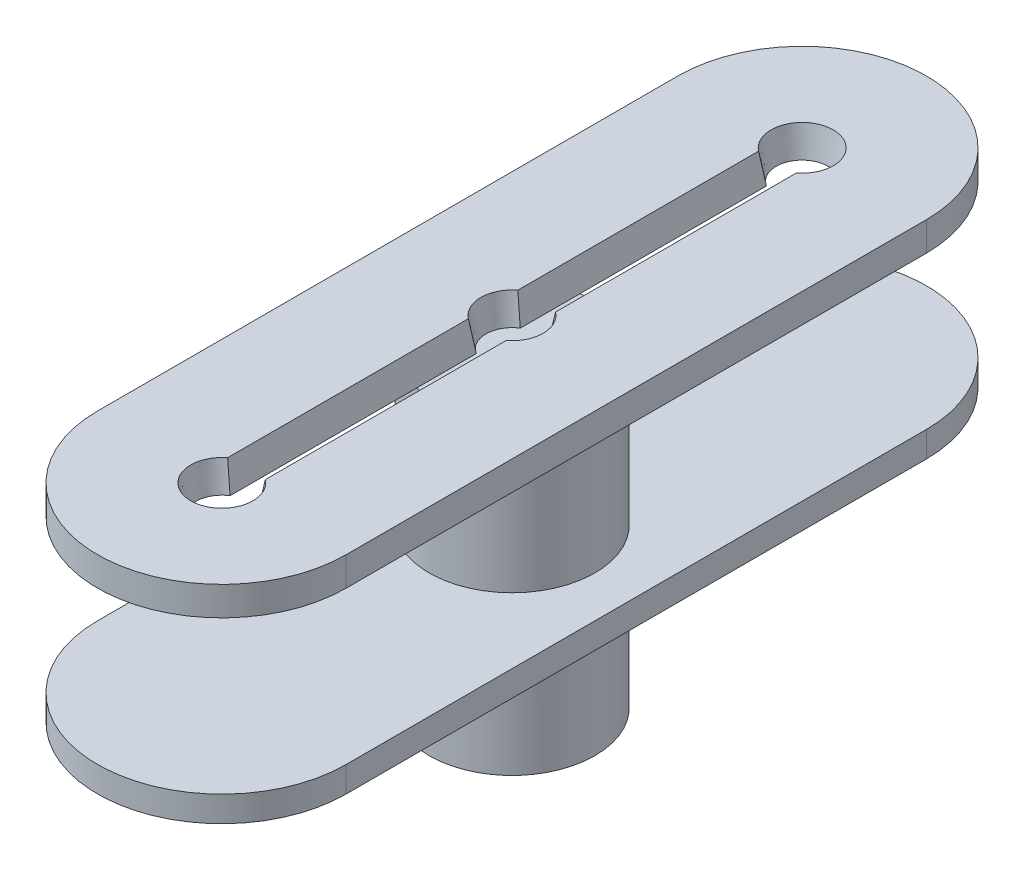
ISO-10303-21;
HEADER;
FILE_DESCRIPTION(('STEP AP214'),'2;1');
FILE_NAME('part.step','',(''),(''),'','','');
FILE_SCHEMA(('AUTOMOTIVE_DESIGN { 1 0 10303 214 1 1 1 1 }'));
ENDSEC;
DATA;
#1=APPLICATION_CONTEXT('core data for automotive mechanical design processes');
#2=APPLICATION_PROTOCOL_DEFINITION('international standard','automotive_design',2000,#1);
#3=PRODUCT_CONTEXT('',#1,'mechanical');
#4=PRODUCT('Part','Part','',(#3));
#5=PRODUCT_RELATED_PRODUCT_CATEGORY('part','',(#4));
#6=PRODUCT_DEFINITION_FORMATION('','',#4);
#7=PRODUCT_DEFINITION_CONTEXT('part definition',#1,'design');
#8=PRODUCT_DEFINITION('design','',#6,#7);
#9=PRODUCT_DEFINITION_SHAPE('','',#8);
#10=(LENGTH_UNIT() NAMED_UNIT(*) SI_UNIT(.MILLI.,.METRE.));
#11=(NAMED_UNIT(*) PLANE_ANGLE_UNIT() SI_UNIT($,.RADIAN.));
#12=(NAMED_UNIT(*) SI_UNIT($,.STERADIAN.) SOLID_ANGLE_UNIT());
#13=UNCERTAINTY_MEASURE_WITH_UNIT(LENGTH_MEASURE(1.E-05),#10,'distance_accuracy_value','');
#14=(GEOMETRIC_REPRESENTATION_CONTEXT(3) GLOBAL_UNCERTAINTY_ASSIGNED_CONTEXT((#13)) GLOBAL_UNIT_ASSIGNED_CONTEXT((#10,
#11,#12)) REPRESENTATION_CONTEXT('',''));
#15=CARTESIAN_POINT('',(0.,0.,0.));
#16=DIRECTION('',(0.,0.,1.));
#17=DIRECTION('',(1.,0.,0.));
#18=AXIS2_PLACEMENT_3D('',#15,#16,#17);
#19=CARTESIAN_POINT('',(0.,-3.2,0.));
#20=DIRECTION('',(0.,1.,0.));
#21=DIRECTION('',(0.,0.,1.));
#22=AXIS2_PLACEMENT_3D('',#19,#20,#21);
#23=CYLINDRICAL_SURFACE('',#22,2.);
#24=CARTESIAN_POINT('',(0.,4.3,0.));
#25=DIRECTION('',(0.,-1.,0.));
#26=DIRECTION('',(0.,0.,-1.));
#27=AXIS2_PLACEMENT_3D('',#24,#25,#26);
#28=CIRCLE('',#27,2.);
#29=CARTESIAN_POINT('',(0.332158694182165,4.3,-1.9722247848253));
#30=VERTEX_POINT('',#29);
#31=CARTESIAN_POINT('',(0.332158694182165,4.3,1.9722247848253));
#32=VERTEX_POINT('',#31);
#33=EDGE_CURVE('E60',#30,#32,#28,.T.);
#34=ORIENTED_EDGE('',*,*,#33,.T.);
#35=CARTESIAN_POINT('',(-0.332158694182165,4.3,1.9722247848253));
#36=VERTEX_POINT('',#35);
#37=EDGE_CURVE('E216',#32,#36,#28,.T.);
#38=ORIENTED_EDGE('',*,*,#37,.T.);
#39=CARTESIAN_POINT('',(-0.332158694182165,4.3,-1.9722247848253));
#40=VERTEX_POINT('',#39);
#41=EDGE_CURVE('E67',#36,#40,#28,.T.);
#42=ORIENTED_EDGE('',*,*,#41,.T.);
#43=EDGE_CURVE('E217',#40,#30,#28,.T.);
#44=ORIENTED_EDGE('',*,*,#43,.T.);
#45=EDGE_LOOP('',(#34,#38,#42,#44));
#46=FACE_BOUND('',#45,.T.);
#47=CARTESIAN_POINT('',(0.,0.617728594575585,0.));
#48=DIRECTION('',(0.,-1.,0.));
#49=DIRECTION('',(0.,0.,-1.));
#50=AXIS2_PLACEMENT_3D('',#47,#48,#49);
#51=CIRCLE('',#50,2.);
#52=CARTESIAN_POINT('',(0.,0.617728594575585,-2.));
#53=VERTEX_POINT('',#52);
#54=EDGE_CURVE('E53',#53,#53,#51,.T.);
#55=ORIENTED_EDGE('',*,*,#54,.F.);
#56=EDGE_LOOP('',(#55));
#57=FACE_BOUND('',#56,.T.);
#58=ADVANCED_FACE('F44',(#46,#57),#23,.T.);
#59=CARTESIAN_POINT('',(-3.,5.,7.));
#60=DIRECTION('',(1.,0.,0.));
#61=DIRECTION('',(0.,0.,-1.));
#62=AXIS2_PLACEMENT_3D('',#59,#60,#61);
#63=PLANE('',#62);
#64=DIRECTION('',(0.,-1.,0.));
#65=VECTOR('',#64,1.);
#66=CARTESIAN_POINT('',(-3.,5.,-7.));
#67=LINE('',#66,#65);
#68=CARTESIAN_POINT('',(-3.,5.,-7.));
#69=VERTEX_POINT('',#68);
#70=CARTESIAN_POINT('',(-3.,4.3,-7.));
#71=VERTEX_POINT('',#70);
#72=EDGE_CURVE('E430',#69,#71,#67,.T.);
#73=ORIENTED_EDGE('',*,*,#72,.T.);
#74=DIRECTION('',(0.,0.,1.));
#75=VECTOR('',#74,1.);
#76=CARTESIAN_POINT('',(-3.,4.3,10.));
#77=LINE('',#76,#75);
#78=CARTESIAN_POINT('',(-3.,4.3,7.));
#79=VERTEX_POINT('',#78);
#80=EDGE_CURVE('E218',#71,#79,#77,.T.);
#81=ORIENTED_EDGE('',*,*,#80,.T.);
#82=DIRECTION('',(0.,-1.,0.));
#83=VECTOR('',#82,1.);
#84=CARTESIAN_POINT('',(-3.,5.,7.));
#85=LINE('',#84,#83);
#86=CARTESIAN_POINT('',(-3.,5.,7.));
#87=VERTEX_POINT('',#86);
#88=EDGE_CURVE('E434',#87,#79,#85,.T.);
#89=ORIENTED_EDGE('',*,*,#88,.F.);
#90=DIRECTION('',(0.,0.,1.));
#91=VECTOR('',#90,1.);
#92=CARTESIAN_POINT('',(-3.,5.,7.));
#93=LINE('',#92,#91);
#94=EDGE_CURVE('E438',#69,#87,#93,.T.);
#95=ORIENTED_EDGE('',*,*,#94,.F.);
#96=EDGE_LOOP('',(#73,#81,#89,#95));
#97=FACE_BOUND('',#96,.T.);
#98=ADVANCED_FACE('F348',(#97),#63,.F.);
#99=CARTESIAN_POINT('',(0.,5.,-7.));
#100=DIRECTION('',(0.,-1.,0.));
#101=DIRECTION('',(0.,0.,-1.));
#102=AXIS2_PLACEMENT_3D('',#99,#100,#101);
#103=CYLINDRICAL_SURFACE('',#102,3.);
#104=DIRECTION('',(0.,-1.,0.));
#105=VECTOR('',#104,1.);
#106=CARTESIAN_POINT('',(3.,5.,-7.));
#107=LINE('',#106,#105);
#108=CARTESIAN_POINT('',(3.,5.,-7.));
#109=VERTEX_POINT('',#108);
#110=CARTESIAN_POINT('',(3.,4.3,-7.));
#111=VERTEX_POINT('',#110);
#112=EDGE_CURVE('E426',#109,#111,#107,.T.);
#113=ORIENTED_EDGE('',*,*,#112,.T.);
#114=CARTESIAN_POINT('',(0.,4.3,-7.));
#115=DIRECTION('',(0.,1.,0.));
#116=DIRECTION('',(0.,0.,1.));
#117=AXIS2_PLACEMENT_3D('',#114,#115,#116);
#118=CIRCLE('',#117,3.);
#119=EDGE_CURVE('E251',#111,#71,#118,.T.);
#120=ORIENTED_EDGE('',*,*,#119,.T.);
#121=ORIENTED_EDGE('',*,*,#72,.F.);
#122=CARTESIAN_POINT('',(0.,5.,-7.));
#123=DIRECTION('',(0.,1.,0.));
#124=DIRECTION('',(0.,0.,1.));
#125=AXIS2_PLACEMENT_3D('',#122,#123,#124);
#126=CIRCLE('',#125,3.);
#127=EDGE_CURVE('E441',#109,#69,#126,.T.);
#128=ORIENTED_EDGE('',*,*,#127,.F.);
#129=EDGE_LOOP('',(#113,#120,#121,#128));
#130=FACE_BOUND('',#129,.T.);
#131=ADVANCED_FACE('F351',(#130),#103,.T.);
#132=CARTESIAN_POINT('',(3.,5.,7.));
#133=DIRECTION('',(-1.,0.,0.));
#134=DIRECTION('',(0.,0.,1.));
#135=AXIS2_PLACEMENT_3D('',#132,#133,#134);
#136=PLANE('',#135);
#137=DIRECTION('',(0.,-1.,0.));
#138=VECTOR('',#137,1.);
#139=CARTESIAN_POINT('',(3.,5.,7.));
#140=LINE('',#139,#138);
#141=CARTESIAN_POINT('',(3.,5.,7.));
#142=VERTEX_POINT('',#141);
#143=CARTESIAN_POINT('',(3.,4.3,7.));
#144=VERTEX_POINT('',#143);
#145=EDGE_CURVE('E422',#142,#144,#140,.T.);
#146=ORIENTED_EDGE('',*,*,#145,.T.);
#147=DIRECTION('',(0.,0.,1.));
#148=VECTOR('',#147,1.);
#149=CARTESIAN_POINT('',(3.,4.3,10.));
#150=LINE('',#149,#148);
#151=EDGE_CURVE('E213',#111,#144,#150,.T.);
#152=ORIENTED_EDGE('',*,*,#151,.F.);
#153=ORIENTED_EDGE('',*,*,#112,.F.);
#154=DIRECTION('',(0.,0.,-1.));
#155=VECTOR('',#154,1.);
#156=CARTESIAN_POINT('',(3.,5.,7.));
#157=LINE('',#156,#155);
#158=EDGE_CURVE('E443',#142,#109,#157,.T.);
#159=ORIENTED_EDGE('',*,*,#158,.F.);
#160=EDGE_LOOP('',(#146,#152,#153,#159));
#161=FACE_BOUND('',#160,.T.);
#162=ADVANCED_FACE('F354',(#161),#136,.F.);
#163=CARTESIAN_POINT('',(0.,5.,7.));
#164=DIRECTION('',(0.,-1.,0.));
#165=DIRECTION('',(0.,0.,-1.));
#166=AXIS2_PLACEMENT_3D('',#163,#164,#165);
#167=CYLINDRICAL_SURFACE('',#166,3.);
#168=CARTESIAN_POINT('',(0.,4.3,7.));
#169=DIRECTION('',(0.,1.,0.));
#170=DIRECTION('',(0.,0.,1.));
#171=AXIS2_PLACEMENT_3D('',#168,#169,#170);
#172=CIRCLE('',#171,3.);
#173=EDGE_CURVE('E254',#79,#144,#172,.T.);
#174=ORIENTED_EDGE('',*,*,#173,.T.);
#175=ORIENTED_EDGE('',*,*,#145,.F.);
#176=CARTESIAN_POINT('',(0.,5.,7.));
#177=DIRECTION('',(0.,1.,0.));
#178=DIRECTION('',(0.,0.,1.));
#179=AXIS2_PLACEMENT_3D('',#176,#177,#178);
#180=CIRCLE('',#179,3.);
#181=EDGE_CURVE('E299',#87,#142,#180,.T.);
#182=ORIENTED_EDGE('',*,*,#181,.F.);
#183=ORIENTED_EDGE('',*,*,#88,.T.);
#184=EDGE_LOOP('',(#174,#175,#182,#183));
#185=FACE_BOUND('',#184,.T.);
#186=ADVANCED_FACE('F46',(#185),#167,.T.);
#187=CARTESIAN_POINT('',(0.,5.,7.));
#188=DIRECTION('',(0.,1.,0.));
#189=DIRECTION('',(0.,0.,1.));
#190=AXIS2_PLACEMENT_3D('',#187,#188,#189);
#191=PLANE('',#190);
#192=CARTESIAN_POINT('',(0.,5.,-7.));
#193=DIRECTION('',(0.,1.,0.));
#194=DIRECTION('',(0.,0.,1.));
#195=AXIS2_PLACEMENT_3D('',#192,#193,#194);
#196=CIRCLE('',#195,0.75);
#197=CARTESIAN_POINT('',(0.45558758067809,5.,-6.4042316252671));
#198=VERTEX_POINT('',#197);
#199=CARTESIAN_POINT('',(-0.455587580678091,5.,-6.4042316252671));
#200=VERTEX_POINT('',#199);
#201=EDGE_CURVE('E257',#198,#200,#196,.T.);
#202=ORIENTED_EDGE('',*,*,#201,.F.);
#203=DIRECTION('',(0.,0.,-1.));
#204=VECTOR('',#203,1.);
#205=CARTESIAN_POINT('',(0.45558758067809,5.,-6.4042316252671));
#206=LINE('',#205,#204);
#207=CARTESIAN_POINT('',(0.455587580678091,5.,-0.595768374732903));
#208=VERTEX_POINT('',#207);
#209=EDGE_CURVE('E285',#208,#198,#206,.T.);
#210=ORIENTED_EDGE('',*,*,#209,.F.);
#211=CARTESIAN_POINT('',(0.,5.,0.));
#212=DIRECTION('',(0.,1.,0.));
#213=DIRECTION('',(0.,0.,1.));
#214=AXIS2_PLACEMENT_3D('',#211,#212,#213);
#215=CIRCLE('',#214,0.75);
#216=CARTESIAN_POINT('',(0.45558758067809,5.,0.595768374732903));
#217=VERTEX_POINT('',#216);
#218=EDGE_CURVE('E281',#217,#208,#215,.T.);
#219=ORIENTED_EDGE('',*,*,#218,.F.);
#220=DIRECTION('',(0.,0.,-1.));
#221=VECTOR('',#220,1.);
#222=CARTESIAN_POINT('',(0.45558758067809,5.,0.595768374732903));
#223=LINE('',#222,#221);
#224=CARTESIAN_POINT('',(0.455587580678091,5.,6.4042316252671));
#225=VERTEX_POINT('',#224);
#226=EDGE_CURVE('E277',#225,#217,#223,.T.);
#227=ORIENTED_EDGE('',*,*,#226,.F.);
#228=CARTESIAN_POINT('',(0.,5.,7.));
#229=DIRECTION('',(0.,1.,0.));
#230=DIRECTION('',(0.,0.,1.));
#231=AXIS2_PLACEMENT_3D('',#228,#229,#230);
#232=CIRCLE('',#231,0.75);
#233=CARTESIAN_POINT('',(-0.455587580678089,5.,6.4042316252671));
#234=VERTEX_POINT('',#233);
#235=EDGE_CURVE('E273',#234,#225,#232,.T.);
#236=ORIENTED_EDGE('',*,*,#235,.F.);
#237=DIRECTION('',(0.,0.,1.));
#238=VECTOR('',#237,1.);
#239=CARTESIAN_POINT('',(-0.455587580678091,5.,0.595768374732903));
#240=LINE('',#239,#238);
#241=CARTESIAN_POINT('',(-0.455587580678091,5.,0.595768374732903));
#242=VERTEX_POINT('',#241);
#243=EDGE_CURVE('E269',#242,#234,#240,.T.);
#244=ORIENTED_EDGE('',*,*,#243,.F.);
#245=CARTESIAN_POINT('',(0.,5.,0.));
#246=DIRECTION('',(0.,1.,0.));
#247=DIRECTION('',(0.,0.,1.));
#248=AXIS2_PLACEMENT_3D('',#245,#246,#247);
#249=CIRCLE('',#248,0.75);
#250=CARTESIAN_POINT('',(-0.455587580678091,5.,-0.595768374732902));
#251=VERTEX_POINT('',#250);
#252=EDGE_CURVE('E265',#251,#242,#249,.T.);
#253=ORIENTED_EDGE('',*,*,#252,.F.);
#254=DIRECTION('',(0.,0.,1.));
#255=VECTOR('',#254,1.);
#256=CARTESIAN_POINT('',(-0.455587580678091,5.,-6.4042316252671));
#257=LINE('',#256,#255);
#258=EDGE_CURVE('E261',#200,#251,#257,.T.);
#259=ORIENTED_EDGE('',*,*,#258,.F.);
#260=EDGE_LOOP('',(#202,#210,#219,#227,#236,#244,#253,#259));
#261=FACE_BOUND('',#260,.T.);
#262=ORIENTED_EDGE('',*,*,#181,.T.);
#263=ORIENTED_EDGE('',*,*,#158,.T.);
#264=ORIENTED_EDGE('',*,*,#127,.T.);
#265=ORIENTED_EDGE('',*,*,#94,.T.);
#266=EDGE_LOOP('',(#262,#263,#264,#265));
#267=FACE_BOUND('',#266,.T.);
#268=ADVANCED_FACE('F343',(#261,#267),#191,.T.);
#269=CARTESIAN_POINT('',(-0.455587580678091,5.,-6.4042316252671));
#270=DIRECTION('',(-0.984807753012208,-0.173648177666931,0.));
#271=DIRECTION('',(0.173648177666931,-0.984807753012208,0.));
#272=AXIS2_PLACEMENT_3D('',#269,#270,#271);
#273=PLANE('',#272);
#274=CARTESIAN_POINT('',(-0.279260599969625,4.,-0.501113011572985));
#275=CARTESIAN_POINT('',(-0.293942387979891,4.0832645574221,-0.509736635471561));
#276=CARTESIAN_POINT('',(-0.30862795832783,4.16655056554708,-0.518144217812719));
#277=CARTESIAN_POINT('',(-0.338005317972142,4.33315785120624,-0.534577093714794));
#278=CARTESIAN_POINT('',(-0.352697107165911,4.41647912815852,-0.542602393352512));
#279=CARTESIAN_POINT('',(-0.382085948727496,4.58315153100636,-0.558320728057934));
#280=CARTESIAN_POINT('',(-0.396783001067315,4.66650265674314,-0.566013764867417));
#281=CARTESIAN_POINT('',(-0.426181924106393,4.83323223449101,-0.581103959904622));
#282=CARTESIAN_POINT('',(-0.440883794878428,4.91661068691482,-0.588501113434233));
#283=CARTESIAN_POINT('',(-0.455587580678091,5.,-0.595768374732903));
#284=B_SPLINE_CURVE_WITH_KNOTS('',3,(#274,#275,#276,#277,#278,#279,#280,#281,#282,#283),
.UNSPECIFIED.,.F.,.F.,(4,2,2,2,4),(0.,0.254962444373639,0.509920834487025,0.7648778879025,
1.01983898798709),.UNSPECIFIED.);
#285=CARTESIAN_POINT('',(-0.332158694182165,4.3,-0.531283316279492));
#286=VERTEX_POINT('',#285);
#287=EDGE_CURVE('E476',#286,#251,#284,.T.);
#288=ORIENTED_EDGE('',*,*,#287,.F.);
#289=DIRECTION('',(0.,0.,-1.));
#290=VECTOR('',#289,1.);
#291=CARTESIAN_POINT('',(-0.332158694182166,4.3,-6.4042316252671));
#292=LINE('',#291,#290);
#293=EDGE_CURVE('E412',#286,#40,#292,.T.);
#294=ORIENTED_EDGE('',*,*,#293,.T.);
#295=CARTESIAN_POINT('',(-0.332158694182168,4.30000000000001,-6.46871668372049));
#296=VERTEX_POINT('',#295);
#297=EDGE_CURVE('E416',#40,#296,#292,.T.);
#298=ORIENTED_EDGE('',*,*,#297,.T.);
#299=CARTESIAN_POINT('',(-0.279260599969626,4.,-6.49888698842701));
#300=CARTESIAN_POINT('',(-0.293942387979891,4.0832645574221,-6.49026336452844));
#301=CARTESIAN_POINT('',(-0.308627958327831,4.16655056554708,-6.48185578218728));
#302=CARTESIAN_POINT('',(-0.338005317972143,4.33315785120624,-6.46542290628521));
#303=CARTESIAN_POINT('',(-0.352697107165912,4.41647912815852,-6.45739760664749));
#304=CARTESIAN_POINT('',(-0.382085948727497,4.58315153100636,-6.44167927194207));
#305=CARTESIAN_POINT('',(-0.396783001067315,4.66650265674314,-6.43398623513258));
#306=CARTESIAN_POINT('',(-0.426181924106394,4.83323223449101,-6.41889604009538));
#307=CARTESIAN_POINT('',(-0.440883794878428,4.91661068691482,-6.41149888656577));
#308=CARTESIAN_POINT('',(-0.455587580678091,5.,-6.4042316252671));
#309=B_SPLINE_CURVE_WITH_KNOTS('',3,(#299,#300,#301,#302,#303,#304,#305,#306,#307,#308),
.UNSPECIFIED.,.F.,.F.,(4,2,2,2,4),(0.,0.254962444373639,0.509920834487025,0.7648778879025,
1.01983898798709),.UNSPECIFIED.);
#310=EDGE_CURVE('E289',#296,#200,#309,.T.);
#311=ORIENTED_EDGE('',*,*,#310,.T.);
#312=ORIENTED_EDGE('',*,*,#258,.T.);
#313=EDGE_LOOP('',(#288,#294,#298,#311,#312));
#314=FACE_BOUND('',#313,.T.);
#315=ADVANCED_FACE('F315',(#314),#273,.F.);
#316=CARTESIAN_POINT('',(0.,5.,0.));
#317=DIRECTION('',(0.,1.,0.));
#318=DIRECTION('',(0.,0.,1.));
#319=AXIS2_PLACEMENT_3D('',#316,#317,#318);
#320=CONICAL_SURFACE('',#319,0.75,0.174532925199433);
#321=CARTESIAN_POINT('',(-0.279260599969625,4.,0.501113011572986));
#322=CARTESIAN_POINT('',(-0.29394238797989,4.0832645574221,0.509736635471561));
#323=CARTESIAN_POINT('',(-0.30862795832783,4.16655056554708,0.518144217812719));
#324=CARTESIAN_POINT('',(-0.338005317972142,4.33315785120624,0.534577093714794));
#325=CARTESIAN_POINT('',(-0.352697107165911,4.41647912815852,0.542602393352512));
#326=CARTESIAN_POINT('',(-0.382085948727496,4.58315153100636,0.558320728057934));
#327=CARTESIAN_POINT('',(-0.396783001067314,4.66650265674314,0.566013764867417));
#328=CARTESIAN_POINT('',(-0.426181924106393,4.83323223449101,0.581103959904622));
#329=CARTESIAN_POINT('',(-0.440883794878427,4.91661068691482,0.588501113434233));
#330=CARTESIAN_POINT('',(-0.455587580678091,5.,0.595768374732903));
#331=B_SPLINE_CURVE_WITH_KNOTS('',3,(#321,#322,#323,#324,#325,#326,#327,#328,#329,#330),
.UNSPECIFIED.,.F.,.F.,(4,2,2,2,4),(0.,0.254962444373639,0.509920834487025,0.7648778879025,
1.01983898798709),.UNSPECIFIED.);
#332=CARTESIAN_POINT('',(-0.332158694182165,4.3,0.531283316279492));
#333=VERTEX_POINT('',#332);
#334=EDGE_CURVE('E478',#333,#242,#331,.T.);
#335=ORIENTED_EDGE('',*,*,#334,.F.);
#336=CARTESIAN_POINT('',(0.,4.3,0.));
#337=DIRECTION('',(0.,1.,0.));
#338=DIRECTION('',(0.,0.,1.));
#339=AXIS2_PLACEMENT_3D('',#336,#337,#338);
#340=CIRCLE('',#339,0.626571113504074);
#341=EDGE_CURVE('E222',#333,#286,#340,.F.);
#342=ORIENTED_EDGE('',*,*,#341,.T.);
#343=ORIENTED_EDGE('',*,*,#287,.T.);
#344=ORIENTED_EDGE('',*,*,#252,.T.);
#345=EDGE_LOOP('',(#335,#342,#343,#344));
#346=FACE_BOUND('',#345,.T.);
#347=ADVANCED_FACE('F493',(#346),#320,.F.);
#348=CARTESIAN_POINT('',(-0.455587580678091,5.,0.595768374732903));
#349=DIRECTION('',(-0.984807753012208,-0.173648177666931,0.));
#350=DIRECTION('',(0.173648177666931,-0.984807753012208,0.));
#351=AXIS2_PLACEMENT_3D('',#348,#349,#350);
#352=PLANE('',#351);
#353=CARTESIAN_POINT('',(-0.279260599969624,4.,6.49888698842701));
#354=CARTESIAN_POINT('',(-0.29394238797989,4.0832645574221,6.49026336452844));
#355=CARTESIAN_POINT('',(-0.308627958327829,4.16655056554708,6.48185578218728));
#356=CARTESIAN_POINT('',(-0.338005317972141,4.33315785120624,6.46542290628521));
#357=CARTESIAN_POINT('',(-0.35269710716591,4.41647912815852,6.45739760664749));
#358=CARTESIAN_POINT('',(-0.382085948727495,4.58315153100636,6.44167927194207));
#359=CARTESIAN_POINT('',(-0.396783001067314,4.66650265674314,6.43398623513258));
#360=CARTESIAN_POINT('',(-0.426181924106392,4.83323223449101,6.41889604009538));
#361=CARTESIAN_POINT('',(-0.440883794878427,4.91661068691482,6.41149888656576));
#362=CARTESIAN_POINT('',(-0.45558758067809,5.,6.4042316252671));
#363=B_SPLINE_CURVE_WITH_KNOTS('',3,(#353,#354,#355,#356,#357,#358,#359,#360,#361,#362),
.UNSPECIFIED.,.F.,.F.,(4,2,2,2,4),(0.,0.254962444373639,0.509920834487024,0.7648778879025,
1.01983898798709),.UNSPECIFIED.);
#364=CARTESIAN_POINT('',(-0.332158694182164,4.3,6.46871668372051));
#365=VERTEX_POINT('',#364);
#366=EDGE_CURVE('E481',#365,#234,#363,.T.);
#367=ORIENTED_EDGE('',*,*,#366,.F.);
#368=DIRECTION('',(0.,0.,-1.));
#369=VECTOR('',#368,1.);
#370=CARTESIAN_POINT('',(-0.332158694182165,4.3,0.595768374732903));
#371=LINE('',#370,#369);
#372=EDGE_CURVE('E229',#365,#36,#371,.T.);
#373=ORIENTED_EDGE('',*,*,#372,.T.);
#374=EDGE_CURVE('E228',#36,#333,#371,.T.);
#375=ORIENTED_EDGE('',*,*,#374,.T.);
#376=ORIENTED_EDGE('',*,*,#334,.T.);
#377=ORIENTED_EDGE('',*,*,#243,.T.);
#378=EDGE_LOOP('',(#367,#373,#375,#376,#377));
#379=FACE_BOUND('',#378,.T.);
#380=ADVANCED_FACE('F496',(#379),#352,.F.);
#381=CARTESIAN_POINT('',(0.,5.,7.));
#382=DIRECTION('',(0.,1.,0.));
#383=DIRECTION('',(0.,0.,1.));
#384=AXIS2_PLACEMENT_3D('',#381,#382,#383);
#385=CONICAL_SURFACE('',#384,0.75,0.174532925199433);
#386=CARTESIAN_POINT('',(0.279260599969625,4.,6.49888698842701));
#387=CARTESIAN_POINT('',(0.293942387979891,4.0832645574221,6.49026336452844));
#388=CARTESIAN_POINT('',(0.30862795832783,4.16655056554708,6.48185578218728));
#389=CARTESIAN_POINT('',(0.338005317972142,4.33315785120624,6.46542290628521));
#390=CARTESIAN_POINT('',(0.352697107165911,4.41647912815852,6.45739760664749));
#391=CARTESIAN_POINT('',(0.382085948727497,4.58315153100636,6.44167927194207));
#392=CARTESIAN_POINT('',(0.396783001067315,4.66650265674314,6.43398623513258));
#393=CARTESIAN_POINT('',(0.426181924106393,4.83323223449101,6.41889604009538));
#394=CARTESIAN_POINT('',(0.440883794878428,4.91661068691482,6.41149888656577));
#395=CARTESIAN_POINT('',(0.455587580678091,5.,6.4042316252671));
#396=B_SPLINE_CURVE_WITH_KNOTS('',3,(#386,#387,#388,#389,#390,#391,#392,#393,#394,#395),
.UNSPECIFIED.,.F.,.F.,(4,2,2,2,4),(0.,0.254962444373639,0.509920834487025,0.7648778879025,
1.01983898798709),.UNSPECIFIED.);
#397=CARTESIAN_POINT('',(0.332158694182165,4.3,6.46871668372051));
#398=VERTEX_POINT('',#397);
#399=EDGE_CURVE('E509',#398,#225,#396,.T.);
#400=ORIENTED_EDGE('',*,*,#399,.F.);
#401=CARTESIAN_POINT('',(0.,4.3,7.));
#402=DIRECTION('',(0.,1.,0.));
#403=DIRECTION('',(0.,0.,1.));
#404=AXIS2_PLACEMENT_3D('',#401,#402,#403);
#405=CIRCLE('',#404,0.626571113504074);
#406=EDGE_CURVE('E232',#398,#365,#405,.F.);
#407=ORIENTED_EDGE('',*,*,#406,.T.);
#408=ORIENTED_EDGE('',*,*,#366,.T.);
#409=ORIENTED_EDGE('',*,*,#235,.T.);
#410=EDGE_LOOP('',(#400,#407,#408,#409));
#411=FACE_BOUND('',#410,.T.);
#412=ADVANCED_FACE('F500',(#411),#385,.F.);
#413=CARTESIAN_POINT('',(0.45558758067809,5.,0.595768374732903));
#414=DIRECTION('',(0.984807753012208,-0.173648177666931,0.));
#415=DIRECTION('',(0.173648177666931,0.984807753012208,0.));
#416=AXIS2_PLACEMENT_3D('',#413,#414,#415);
#417=PLANE('',#416);
#418=CARTESIAN_POINT('',(0.279260599969625,4.,0.501113011572986));
#419=CARTESIAN_POINT('',(0.29394238797989,4.0832645574221,0.509736635471561));
#420=CARTESIAN_POINT('',(0.30862795832783,4.16655056554708,0.51814421781272));
#421=CARTESIAN_POINT('',(0.338005317972142,4.33315785120624,0.534577093714794));
#422=CARTESIAN_POINT('',(0.352697107165911,4.41647912815852,0.542602393352513));
#423=CARTESIAN_POINT('',(0.382085948727496,4.58315153100636,0.558320728057935));
#424=CARTESIAN_POINT('',(0.396783001067314,4.66650265674314,0.566013764867417));
#425=CARTESIAN_POINT('',(0.426181924106393,4.83323223449101,0.581103959904622));
#426=CARTESIAN_POINT('',(0.440883794878427,4.91661068691482,0.588501113434233));
#427=CARTESIAN_POINT('',(0.45558758067809,5.,0.595768374732903));
#428=B_SPLINE_CURVE_WITH_KNOTS('',3,(#418,#419,#420,#421,#422,#423,#424,#425,#426,#427),
.UNSPECIFIED.,.F.,.F.,(4,2,2,2,4),(0.,0.254962444373639,0.509920834487025,0.7648778879025,
1.01983898798709),.UNSPECIFIED.);
#429=CARTESIAN_POINT('',(0.332158694182164,4.3,0.531283316279492));
#430=VERTEX_POINT('',#429);
#431=EDGE_CURVE('E328',#430,#217,#428,.T.);
#432=ORIENTED_EDGE('',*,*,#431,.F.);
#433=DIRECTION('',(0.,0.,1.));
#434=VECTOR('',#433,1.);
#435=CARTESIAN_POINT('',(0.332158694182164,4.3,0.595768374732903));
#436=LINE('',#435,#434);
#437=EDGE_CURVE('E237',#430,#32,#436,.T.);
#438=ORIENTED_EDGE('',*,*,#437,.T.);
#439=EDGE_CURVE('E236',#32,#398,#436,.T.);
#440=ORIENTED_EDGE('',*,*,#439,.T.);
#441=ORIENTED_EDGE('',*,*,#399,.T.);
#442=ORIENTED_EDGE('',*,*,#226,.T.);
#443=EDGE_LOOP('',(#432,#438,#440,#441,#442));
#444=FACE_BOUND('',#443,.T.);
#445=ADVANCED_FACE('F339',(#444),#417,.F.);
#446=CARTESIAN_POINT('',(0.,5.,0.));
#447=DIRECTION('',(0.,1.,0.));
#448=DIRECTION('',(0.,0.,1.));
#449=AXIS2_PLACEMENT_3D('',#446,#447,#448);
#450=CONICAL_SURFACE('',#449,0.75,0.174532925199433);
#451=CARTESIAN_POINT('',(0.279260599969625,4.,-0.501113011572985));
#452=CARTESIAN_POINT('',(0.293942387979891,4.0832645574221,-0.509736635471561));
#453=CARTESIAN_POINT('',(0.30862795832783,4.16655056554708,-0.518144217812719));
#454=CARTESIAN_POINT('',(0.338005317972142,4.33315785120624,-0.534577093714794));
#455=CARTESIAN_POINT('',(0.352697107165911,4.41647912815852,-0.542602393352512));
#456=CARTESIAN_POINT('',(0.382085948727497,4.58315153100636,-0.558320728057934));
#457=CARTESIAN_POINT('',(0.396783001067315,4.66650265674314,-0.566013764867417));
#458=CARTESIAN_POINT('',(0.426181924106393,4.83323223449101,-0.581103959904622));
#459=CARTESIAN_POINT('',(0.440883794878428,4.91661068691482,-0.588501113434233));
#460=CARTESIAN_POINT('',(0.455587580678091,5.,-0.595768374732903));
#461=B_SPLINE_CURVE_WITH_KNOTS('',3,(#451,#452,#453,#454,#455,#456,#457,#458,#459,#460),
.UNSPECIFIED.,.F.,.F.,(4,2,2,2,4),(0.,0.254962444373639,0.509920834487025,0.7648778879025,
1.01983898798709),.UNSPECIFIED.);
#462=CARTESIAN_POINT('',(0.332158694182165,4.3,-0.531283316279492));
#463=VERTEX_POINT('',#462);
#464=EDGE_CURVE('E300',#463,#208,#461,.T.);
#465=ORIENTED_EDGE('',*,*,#464,.F.);
#466=CARTESIAN_POINT('',(0.,4.3,0.));
#467=DIRECTION('',(0.,1.,0.));
#468=DIRECTION('',(0.,0.,1.));
#469=AXIS2_PLACEMENT_3D('',#466,#467,#468);
#470=CIRCLE('',#469,0.626571113504074);
#471=EDGE_CURVE('E240',#463,#430,#470,.F.);
#472=ORIENTED_EDGE('',*,*,#471,.T.);
#473=ORIENTED_EDGE('',*,*,#431,.T.);
#474=ORIENTED_EDGE('',*,*,#218,.T.);
#475=EDGE_LOOP('',(#465,#472,#473,#474));
#476=FACE_BOUND('',#475,.T.);
#477=ADVANCED_FACE('F313',(#476),#450,.F.);
#478=CARTESIAN_POINT('',(0.45558758067809,5.,-6.4042316252671));
#479=DIRECTION('',(0.984807753012208,-0.173648177666931,0.));
#480=DIRECTION('',(0.173648177666931,0.984807753012208,0.));
#481=AXIS2_PLACEMENT_3D('',#478,#479,#480);
#482=PLANE('',#481);
#483=CARTESIAN_POINT('',(0.279260599969625,4.,-6.49888698842701));
#484=CARTESIAN_POINT('',(0.29394238797989,4.0832645574221,-6.49026336452844));
#485=CARTESIAN_POINT('',(0.308627958327829,4.16655056554708,-6.48185578218728));
#486=CARTESIAN_POINT('',(0.338005317972141,4.33315785120624,-6.4654229062852));
#487=CARTESIAN_POINT('',(0.352697107165911,4.41647912815852,-6.45739760664749));
#488=CARTESIAN_POINT('',(0.382085948727496,4.58315153100636,-6.44167927194206));
#489=CARTESIAN_POINT('',(0.396783001067314,4.66650265674314,-6.43398623513258));
#490=CARTESIAN_POINT('',(0.426181924106392,4.83323223449101,-6.41889604009538));
#491=CARTESIAN_POINT('',(0.440883794878427,4.91661068691482,-6.41149888656577));
#492=CARTESIAN_POINT('',(0.45558758067809,5.,-6.4042316252671));
#493=B_SPLINE_CURVE_WITH_KNOTS('',3,(#483,#484,#485,#486,#487,#488,#489,#490,#491,#492),
.UNSPECIFIED.,.F.,.F.,(4,2,2,2,4),(0.,0.254962444373639,0.509920834487025,0.7648778879025,
1.01983898798709),.UNSPECIFIED.);
#494=CARTESIAN_POINT('',(0.332158694182164,4.3,-6.46871668372051));
#495=VERTEX_POINT('',#494);
#496=EDGE_CURVE('E290',#495,#198,#493,.T.);
#497=ORIENTED_EDGE('',*,*,#496,.F.);
#498=DIRECTION('',(0.,0.,1.));
#499=VECTOR('',#498,1.);
#500=CARTESIAN_POINT('',(0.332158694182164,4.3,-6.4042316252671));
#501=LINE('',#500,#499);
#502=EDGE_CURVE('E244',#495,#30,#501,.T.);
#503=ORIENTED_EDGE('',*,*,#502,.T.);
#504=EDGE_CURVE('E243',#30,#463,#501,.T.);
#505=ORIENTED_EDGE('',*,*,#504,.T.);
#506=ORIENTED_EDGE('',*,*,#464,.T.);
#507=ORIENTED_EDGE('',*,*,#209,.T.);
#508=EDGE_LOOP('',(#497,#503,#505,#506,#507));
#509=FACE_BOUND('',#508,.T.);
#510=ADVANCED_FACE('F310',(#509),#482,.F.);
#511=CARTESIAN_POINT('',(0.,5.,-7.));
#512=DIRECTION('',(0.,1.,0.));
#513=DIRECTION('',(0.,0.,1.));
#514=AXIS2_PLACEMENT_3D('',#511,#512,#513);
#515=CONICAL_SURFACE('',#514,0.75,0.174532925199433);
#516=ORIENTED_EDGE('',*,*,#310,.F.);
#517=CARTESIAN_POINT('',(0.,4.3,-7.));
#518=DIRECTION('',(0.,1.,0.));
#519=DIRECTION('',(0.,0.,1.));
#520=AXIS2_PLACEMENT_3D('',#517,#518,#519);
#521=CIRCLE('',#520,0.626571113504074);
#522=EDGE_CURVE('E247',#296,#495,#521,.F.);
#523=ORIENTED_EDGE('',*,*,#522,.T.);
#524=ORIENTED_EDGE('',*,*,#496,.T.);
#525=ORIENTED_EDGE('',*,*,#201,.T.);
#526=EDGE_LOOP('',(#516,#523,#524,#525));
#527=FACE_BOUND('',#526,.T.);
#528=ADVANCED_FACE('F307',(#527),#515,.F.);
#529=CARTESIAN_POINT('',(-3.,4.3,10.));
#530=DIRECTION('',(0.,1.,0.));
#531=DIRECTION('',(0.,0.,1.));
#532=AXIS2_PLACEMENT_3D('',#529,#530,#531);
#533=PLANE('',#532);
#534=ORIENTED_EDGE('',*,*,#33,.F.);
#535=ORIENTED_EDGE('',*,*,#502,.F.);
#536=ORIENTED_EDGE('',*,*,#522,.F.);
#537=ORIENTED_EDGE('',*,*,#297,.F.);
#538=ORIENTED_EDGE('',*,*,#41,.F.);
#539=ORIENTED_EDGE('',*,*,#372,.F.);
#540=ORIENTED_EDGE('',*,*,#406,.F.);
#541=ORIENTED_EDGE('',*,*,#439,.F.);
#542=EDGE_LOOP('',(#534,#535,#536,#537,#538,#539,#540,#541));
#543=FACE_BOUND('',#542,.T.);
#544=ORIENTED_EDGE('',*,*,#173,.F.);
#545=ORIENTED_EDGE('',*,*,#80,.F.);
#546=ORIENTED_EDGE('',*,*,#119,.F.);
#547=ORIENTED_EDGE('',*,*,#151,.T.);
#548=EDGE_LOOP('',(#544,#545,#546,#547));
#549=FACE_BOUND('',#548,.T.);
#550=ADVANCED_FACE('F458',(#543,#549),#533,.F.);
#551=CARTESIAN_POINT('',(0.,4.3,0.));
#552=DIRECTION('',(0.,-1.,0.));
#553=DIRECTION('',(0.,0.,-1.));
#554=AXIS2_PLACEMENT_3D('',#551,#552,#553);
#555=PLANE('',#554);
#556=ORIENTED_EDGE('',*,*,#293,.F.);
#557=ORIENTED_EDGE('',*,*,#341,.F.);
#558=ORIENTED_EDGE('',*,*,#374,.F.);
#559=ORIENTED_EDGE('',*,*,#37,.F.);
#560=ORIENTED_EDGE('',*,*,#437,.F.);
#561=ORIENTED_EDGE('',*,*,#471,.F.);
#562=ORIENTED_EDGE('',*,*,#504,.F.);
#563=ORIENTED_EDGE('',*,*,#43,.F.);
#564=EDGE_LOOP('',(#556,#557,#558,#559,#560,#561,#562,#563));
#565=FACE_BOUND('',#564,.T.);
#566=ADVANCED_FACE('F460',(#565),#555,.F.);
#567=CARTESIAN_POINT('',(0.,5.,7.));
#568=DIRECTION('',(0.,-1.,0.));
#569=DIRECTION('',(0.,0.,-1.));
#570=AXIS2_PLACEMENT_3D('',#567,#568,#569);
#571=CYLINDRICAL_SURFACE('',#570,3.);
#572=DIRECTION('',(0.,-1.,0.));
#573=VECTOR('',#572,1.);
#574=CARTESIAN_POINT('',(3.,5.,7.));
#575=LINE('',#574,#573);
#576=CARTESIAN_POINT('',(3.,0.617728594575585,7.));
#577=VERTEX_POINT('',#576);
#578=CARTESIAN_POINT('',(3.,0.,7.));
#579=VERTEX_POINT('',#578);
#580=EDGE_CURVE('E396',#577,#579,#575,.T.);
#581=ORIENTED_EDGE('',*,*,#580,.F.);
#582=CARTESIAN_POINT('',(0.,0.617728594575585,7.));
#583=DIRECTION('',(0.,-1.,0.));
#584=DIRECTION('',(0.,0.,-1.));
#585=AXIS2_PLACEMENT_3D('',#582,#583,#584);
#586=CIRCLE('',#585,3.);
#587=CARTESIAN_POINT('',(-3.,0.617728594575585,7.));
#588=VERTEX_POINT('',#587);
#589=EDGE_CURVE('E208',#577,#588,#586,.T.);
#590=ORIENTED_EDGE('',*,*,#589,.T.);
#591=DIRECTION('',(0.,-1.,0.));
#592=VECTOR('',#591,1.);
#593=CARTESIAN_POINT('',(-3.,5.,7.));
#594=LINE('',#593,#592);
#595=CARTESIAN_POINT('',(-3.,0.,7.));
#596=VERTEX_POINT('',#595);
#597=EDGE_CURVE('E190',#588,#596,#594,.T.);
#598=ORIENTED_EDGE('',*,*,#597,.T.);
#599=CARTESIAN_POINT('',(0.,0.,7.));
#600=DIRECTION('',(0.,1.,0.));
#601=DIRECTION('',(0.,0.,1.));
#602=AXIS2_PLACEMENT_3D('',#599,#600,#601);
#603=CIRCLE('',#602,3.);
#604=EDGE_CURVE('E207',#596,#579,#603,.T.);
#605=ORIENTED_EDGE('',*,*,#604,.T.);
#606=EDGE_LOOP('',(#581,#590,#598,#605));
#607=FACE_BOUND('',#606,.T.);
#608=ADVANCED_FACE('F464',(#607),#571,.T.);
#609=CARTESIAN_POINT('',(3.,5.,7.));
#610=DIRECTION('',(-1.,0.,0.));
#611=DIRECTION('',(0.,0.,1.));
#612=AXIS2_PLACEMENT_3D('',#609,#610,#611);
#613=PLANE('',#612);
#614=DIRECTION('',(0.,-1.,0.));
#615=VECTOR('',#614,1.);
#616=CARTESIAN_POINT('',(3.,5.,-7.));
#617=LINE('',#616,#615);
#618=CARTESIAN_POINT('',(3.,0.617728594575585,-7.));
#619=VERTEX_POINT('',#618);
#620=CARTESIAN_POINT('',(3.,0.,-7.));
#621=VERTEX_POINT('',#620);
#622=EDGE_CURVE('E182',#619,#621,#617,.T.);
#623=ORIENTED_EDGE('',*,*,#622,.F.);
#624=DIRECTION('',(0.,0.,-1.));
#625=VECTOR('',#624,1.);
#626=CARTESIAN_POINT('',(3.,0.617728594575585,10.));
#627=LINE('',#626,#625);
#628=EDGE_CURVE('E177',#577,#619,#627,.T.);
#629=ORIENTED_EDGE('',*,*,#628,.F.);
#630=ORIENTED_EDGE('',*,*,#580,.T.);
#631=DIRECTION('',(0.,0.,-1.));
#632=VECTOR('',#631,1.);
#633=CARTESIAN_POINT('',(3.,0.,7.));
#634=LINE('',#633,#632);
#635=EDGE_CURVE('E183',#579,#621,#634,.T.);
#636=ORIENTED_EDGE('',*,*,#635,.T.);
#637=EDGE_LOOP('',(#623,#629,#630,#636));
#638=FACE_BOUND('',#637,.T.);
#639=ADVANCED_FACE('F598',(#638),#613,.F.);
#640=CARTESIAN_POINT('',(0.,5.,-7.));
#641=DIRECTION('',(0.,-1.,0.));
#642=DIRECTION('',(0.,0.,-1.));
#643=AXIS2_PLACEMENT_3D('',#640,#641,#642);
#644=CYLINDRICAL_SURFACE('',#643,3.);
#645=CARTESIAN_POINT('',(0.,0.617728594575585,-7.));
#646=DIRECTION('',(0.,-1.,0.));
#647=DIRECTION('',(0.,0.,-1.));
#648=AXIS2_PLACEMENT_3D('',#645,#646,#647);
#649=CIRCLE('',#648,3.);
#650=CARTESIAN_POINT('',(-3.,0.617728594575585,-7.));
#651=VERTEX_POINT('',#650);
#652=EDGE_CURVE('E171',#651,#619,#649,.T.);
#653=ORIENTED_EDGE('',*,*,#652,.T.);
#654=ORIENTED_EDGE('',*,*,#622,.T.);
#655=CARTESIAN_POINT('',(0.,0.,-7.));
#656=DIRECTION('',(0.,1.,0.));
#657=DIRECTION('',(0.,0.,1.));
#658=AXIS2_PLACEMENT_3D('',#655,#656,#657);
#659=CIRCLE('',#658,3.);
#660=CARTESIAN_POINT('',(-3.,0.,-7.));
#661=VERTEX_POINT('',#660);
#662=EDGE_CURVE('E192',#621,#661,#659,.T.);
#663=ORIENTED_EDGE('',*,*,#662,.T.);
#664=DIRECTION('',(0.,-1.,0.));
#665=VECTOR('',#664,1.);
#666=CARTESIAN_POINT('',(-3.,5.,-7.));
#667=LINE('',#666,#665);
#668=EDGE_CURVE('E188',#651,#661,#667,.T.);
#669=ORIENTED_EDGE('',*,*,#668,.F.);
#670=EDGE_LOOP('',(#653,#654,#663,#669));
#671=FACE_BOUND('',#670,.T.);
#672=ADVANCED_FACE('F194',(#671),#644,.T.);
#673=CARTESIAN_POINT('',(-3.,5.,7.));
#674=DIRECTION('',(1.,0.,0.));
#675=DIRECTION('',(0.,0.,-1.));
#676=AXIS2_PLACEMENT_3D('',#673,#674,#675);
#677=PLANE('',#676);
#678=ORIENTED_EDGE('',*,*,#597,.F.);
#679=DIRECTION('',(0.,0.,-1.));
#680=VECTOR('',#679,1.);
#681=CARTESIAN_POINT('',(-3.,0.617728594575585,7.));
#682=LINE('',#681,#680);
#683=EDGE_CURVE('E174',#588,#651,#682,.T.);
#684=ORIENTED_EDGE('',*,*,#683,.T.);
#685=ORIENTED_EDGE('',*,*,#668,.T.);
#686=DIRECTION('',(0.,0.,1.));
#687=VECTOR('',#686,1.);
#688=CARTESIAN_POINT('',(-3.,0.,7.));
#689=LINE('',#688,#687);
#690=EDGE_CURVE('E198',#661,#596,#689,.T.);
#691=ORIENTED_EDGE('',*,*,#690,.T.);
#692=EDGE_LOOP('',(#678,#684,#685,#691));
#693=FACE_BOUND('',#692,.T.);
#694=ADVANCED_FACE('F186',(#693),#677,.F.);
#695=CARTESIAN_POINT('',(0.,0.,7.));
#696=DIRECTION('',(0.,1.,0.));
#697=DIRECTION('',(0.,0.,1.));
#698=AXIS2_PLACEMENT_3D('',#695,#696,#697);
#699=PLANE('',#698);
#700=CARTESIAN_POINT('',(0.,0.,0.));
#701=DIRECTION('',(0.,1.,0.));
#702=DIRECTION('',(0.,0.,1.));
#703=AXIS2_PLACEMENT_3D('',#700,#701,#702);
#704=CIRCLE('',#703,2.);
#705=CARTESIAN_POINT('',(0.,0.,2.));
#706=VERTEX_POINT('',#705);
#707=EDGE_CURVE('E11',#706,#706,#704,.T.);
#708=ORIENTED_EDGE('',*,*,#707,.T.);
#709=EDGE_LOOP('',(#708));
#710=FACE_BOUND('',#709,.T.);
#711=ORIENTED_EDGE('',*,*,#604,.F.);
#712=ORIENTED_EDGE('',*,*,#690,.F.);
#713=ORIENTED_EDGE('',*,*,#662,.F.);
#714=ORIENTED_EDGE('',*,*,#635,.F.);
#715=EDGE_LOOP('',(#711,#712,#713,#714));
#716=FACE_BOUND('',#715,.T.);
#717=ADVANCED_FACE('F385',(#710,#716),#699,.F.);
#718=CARTESIAN_POINT('',(-3.,0.617728594575585,10.));
#719=DIRECTION('',(0.,-1.,0.));
#720=DIRECTION('',(0.,0.,-1.));
#721=AXIS2_PLACEMENT_3D('',#718,#719,#720);
#722=PLANE('',#721);
#723=ORIENTED_EDGE('',*,*,#54,.T.);
#724=EDGE_LOOP('',(#723));
#725=FACE_BOUND('',#724,.T.);
#726=ORIENTED_EDGE('',*,*,#628,.T.);
#727=ORIENTED_EDGE('',*,*,#652,.F.);
#728=ORIENTED_EDGE('',*,*,#683,.F.);
#729=ORIENTED_EDGE('',*,*,#589,.F.);
#730=EDGE_LOOP('',(#726,#727,#728,#729));
#731=FACE_BOUND('',#730,.T.);
#732=ADVANCED_FACE('F173',(#725,#731),#722,.F.);
#733=CARTESIAN_POINT('',(0.,-3.2,0.));
#734=DIRECTION('',(0.,-1.,0.));
#735=DIRECTION('',(0.,0.,-1.));
#736=AXIS2_PLACEMENT_3D('',#733,#734,#735);
#737=PLANE('',#736);
#738=CARTESIAN_POINT('',(0.,-3.2,0.));
#739=DIRECTION('',(0.,-1.,0.));
#740=DIRECTION('',(0.,0.,-1.));
#741=AXIS2_PLACEMENT_3D('',#738,#739,#740);
#742=CIRCLE('',#741,2.);
#743=CARTESIAN_POINT('',(0.,-3.2,-2.));
#744=VERTEX_POINT('',#743);
#745=EDGE_CURVE('E209',#744,#744,#742,.T.);
#746=ORIENTED_EDGE('',*,*,#745,.T.);
#747=EDGE_LOOP('',(#746));
#748=FACE_BOUND('',#747,.T.);
#749=ADVANCED_FACE('F374',(#748),#737,.T.);
#750=ORIENTED_EDGE('',*,*,#745,.F.);
#751=EDGE_LOOP('',(#750));
#752=FACE_BOUND('',#751,.T.);
#753=ORIENTED_EDGE('',*,*,#707,.F.);
#754=EDGE_LOOP('',(#753));
#755=FACE_BOUND('',#754,.T.);
#756=ADVANCED_FACE('F366',(#752,#755),#23,.T.);
#757=CLOSED_SHELL('',(#58,#98,#131,#162,#186,#268,#315,#347,#380,#412,#445,#477,#510,#528,#550,
#566,#608,#639,#672,#694,#717,#732,#749,#756));
#758=MANIFOLD_SOLID_BREP('B2',#757);
#759=ADVANCED_BREP_SHAPE_REPRESENTATION('',(#18,#758),#14);
#760=SHAPE_DEFINITION_REPRESENTATION(#9,#759);
ENDSEC;
END-ISO-10303-21;
